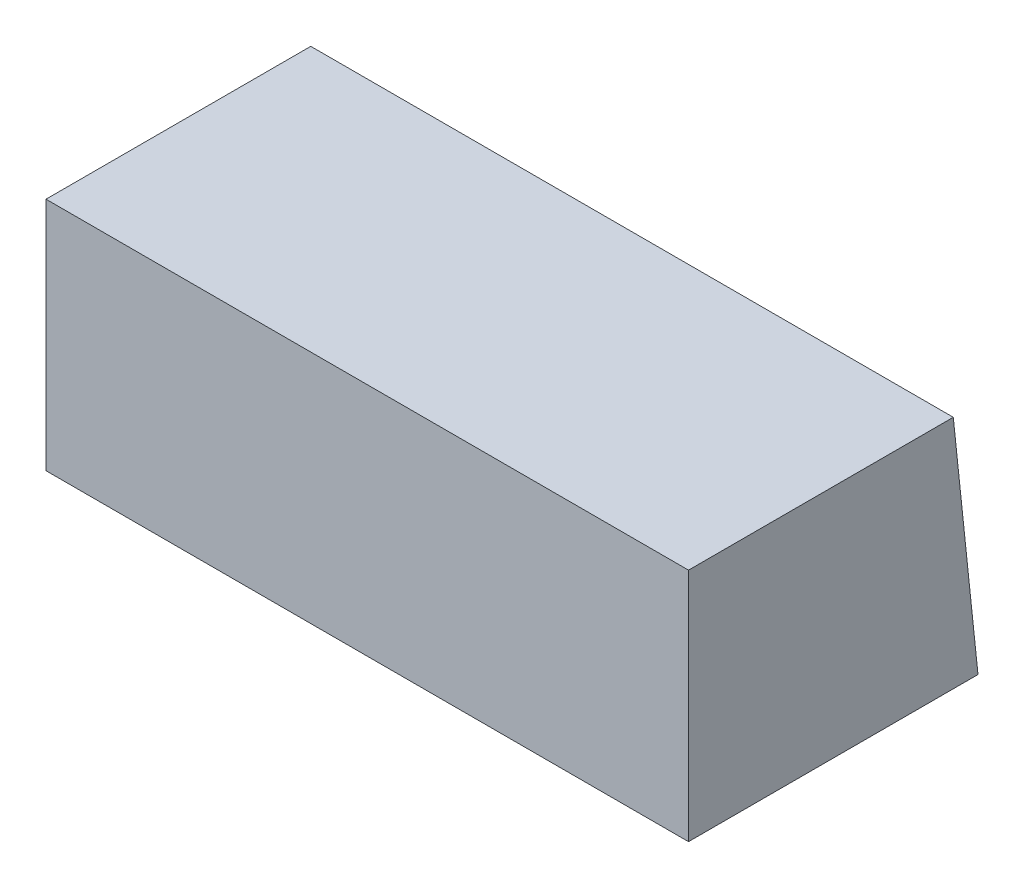
ISO-10303-21;
HEADER;
FILE_DESCRIPTION(('STEP AP214'),'2;1');
FILE_NAME('part.step','',(''),(''),'','','');
FILE_SCHEMA(('AUTOMOTIVE_DESIGN { 1 0 10303 214 1 1 1 1 }'));
ENDSEC;
DATA;
#1=APPLICATION_CONTEXT('core data for automotive mechanical design processes');
#2=APPLICATION_PROTOCOL_DEFINITION('international standard','automotive_design',2000,#1);
#3=PRODUCT_CONTEXT('',#1,'mechanical');
#4=PRODUCT('Part','Part','',(#3));
#5=PRODUCT_RELATED_PRODUCT_CATEGORY('part','',(#4));
#6=PRODUCT_DEFINITION_FORMATION('','',#4);
#7=PRODUCT_DEFINITION_CONTEXT('part definition',#1,'design');
#8=PRODUCT_DEFINITION('design','',#6,#7);
#9=PRODUCT_DEFINITION_SHAPE('','',#8);
#10=(LENGTH_UNIT() NAMED_UNIT(*) SI_UNIT(.MILLI.,.METRE.));
#11=(NAMED_UNIT(*) PLANE_ANGLE_UNIT() SI_UNIT($,.RADIAN.));
#12=(NAMED_UNIT(*) SI_UNIT($,.STERADIAN.) SOLID_ANGLE_UNIT());
#13=UNCERTAINTY_MEASURE_WITH_UNIT(LENGTH_MEASURE(1.E-05),#10,'distance_accuracy_value','');
#14=(GEOMETRIC_REPRESENTATION_CONTEXT(3) GLOBAL_UNCERTAINTY_ASSIGNED_CONTEXT((#13)) GLOBAL_UNIT_ASSIGNED_CONTEXT((#10,
#11,#12)) REPRESENTATION_CONTEXT('',''));
#15=CARTESIAN_POINT('',(0.,0.,0.));
#16=DIRECTION('',(0.,0.,1.));
#17=DIRECTION('',(1.,0.,0.));
#18=AXIS2_PLACEMENT_3D('',#15,#16,#17);
#19=CARTESIAN_POINT('',(53.4582450160276,13.2407708873239,39.4916610984402));
#20=DIRECTION('',(-1.,0.,0.));
#21=DIRECTION('',(0.,0.,1.));
#22=AXIS2_PLACEMENT_3D('',#19,#20,#21);
#23=PLANE('',#22);
#24=DIRECTION('',(0.,-0.994521895368273,-0.104528463267654));
#25=VECTOR('',#24,1.);
#26=CARTESIAN_POINT('',(53.4582450160276,0.,38.1));
#27=LINE('',#26,#25);
#28=CARTESIAN_POINT('',(53.4582450160277,13.2407708873239,39.4916610984402));
#29=VERTEX_POINT('',#28);
#30=CARTESIAN_POINT('',(53.4582450160277,54.8885929453376,43.8690235863287));
#31=VERTEX_POINT('',#30);
#32=EDGE_CURVE('E39',#29,#31,#27,.F.);
#33=ORIENTED_EDGE('',*,*,#32,.T.);
#34=DIRECTION('',(0.,0.,-1.));
#35=VECTOR('',#34,1.);
#36=CARTESIAN_POINT('',(53.4582450160276,54.8885929453376,43.8690235863287));
#37=LINE('',#36,#35);
#38=CARTESIAN_POINT('',(53.4582450160277,54.8885929453376,90.7593904150351));
#39=VERTEX_POINT('',#38);
#40=EDGE_CURVE('E77',#39,#31,#37,.T.);
#41=ORIENTED_EDGE('',*,*,#40,.F.);
#42=DIRECTION('',(0.,-1.,0.));
#43=VECTOR('',#42,1.);
#44=CARTESIAN_POINT('',(53.4582450160276,100.18,90.7593904150351));
#45=LINE('',#44,#43);
#46=CARTESIAN_POINT('',(53.4582450160277,13.2407708873239,90.7593904150351));
#47=VERTEX_POINT('',#46);
#48=EDGE_CURVE('E52',#39,#47,#45,.T.);
#49=ORIENTED_EDGE('',*,*,#48,.T.);
#50=DIRECTION('',(0.,0.,-1.));
#51=VECTOR('',#50,1.);
#52=CARTESIAN_POINT('',(53.4582450160276,13.2407708873239,39.4916610984402));
#53=LINE('',#52,#51);
#54=EDGE_CURVE('E44',#47,#29,#53,.T.);
#55=ORIENTED_EDGE('',*,*,#54,.T.);
#56=EDGE_LOOP('',(#33,#41,#49,#55));
#57=FACE_BOUND('',#56,.T.);
#58=ADVANCED_FACE('F36',(#57),#23,.F.);
#59=CARTESIAN_POINT('',(53.4582450160276,54.8885929453376,43.8690235863287));
#60=DIRECTION('',(0.,-1.,0.));
#61=DIRECTION('',(0.,0.,-1.));
#62=AXIS2_PLACEMENT_3D('',#59,#60,#61);
#63=PLANE('',#62);
#64=DIRECTION('',(1.,0.,0.));
#65=VECTOR('',#64,1.);
#66=CARTESIAN_POINT('',(-68.5799999999999,54.8885929453376,43.8690235863287));
#67=LINE('',#66,#65);
#68=CARTESIAN_POINT('',(-60.3332142431596,54.8885929453376,43.8690235863287));
#69=VERTEX_POINT('',#68);
#70=EDGE_CURVE('E84',#31,#69,#67,.F.);
#71=ORIENTED_EDGE('',*,*,#70,.T.);
#72=DIRECTION('',(0.,0.,-1.));
#73=VECTOR('',#72,1.);
#74=CARTESIAN_POINT('',(-60.3332142431596,54.8885929453376,43.8690235863287));
#75=LINE('',#74,#73);
#76=CARTESIAN_POINT('',(-60.3332142431596,54.8885929453376,90.7593904150351));
#77=VERTEX_POINT('',#76);
#78=EDGE_CURVE('E91',#77,#69,#75,.T.);
#79=ORIENTED_EDGE('',*,*,#78,.F.);
#80=DIRECTION('',(1.,0.,0.));
#81=VECTOR('',#80,1.);
#82=CARTESIAN_POINT('',(-142.792126276609,54.8885929453376,90.7593904150351));
#83=LINE('',#82,#81);
#84=EDGE_CURVE('E90',#77,#39,#83,.T.);
#85=ORIENTED_EDGE('',*,*,#84,.T.);
#86=ORIENTED_EDGE('',*,*,#40,.T.);
#87=EDGE_LOOP('',(#71,#79,#85,#86));
#88=FACE_BOUND('',#87,.T.);
#89=ADVANCED_FACE('F87',(#88),#63,.F.);
#90=CARTESIAN_POINT('',(-60.3332142431596,54.8885929453376,43.8690235863287));
#91=DIRECTION('',(1.,0.,0.));
#92=DIRECTION('',(0.,0.,-1.));
#93=AXIS2_PLACEMENT_3D('',#90,#91,#92);
#94=PLANE('',#93);
#95=DIRECTION('',(0.,0.994521895368273,0.104528463267654));
#96=VECTOR('',#95,1.);
#97=CARTESIAN_POINT('',(-60.3332142431596,0.,38.1));
#98=LINE('',#97,#96);
#99=CARTESIAN_POINT('',(-60.3332142431596,13.2407708873239,39.4916610984402));
#100=VERTEX_POINT('',#99);
#101=EDGE_CURVE('E97',#69,#100,#98,.F.);
#102=ORIENTED_EDGE('',*,*,#101,.T.);
#103=DIRECTION('',(0.,0.,-1.));
#104=VECTOR('',#103,1.);
#105=CARTESIAN_POINT('',(-60.3332142431596,13.2407708873239,39.4916610984402));
#106=LINE('',#105,#104);
#107=CARTESIAN_POINT('',(-60.3332142431596,13.2407708873239,90.7593904150351));
#108=VERTEX_POINT('',#107);
#109=EDGE_CURVE('E11',#108,#100,#106,.T.);
#110=ORIENTED_EDGE('',*,*,#109,.F.);
#111=DIRECTION('',(0.,1.,0.));
#112=VECTOR('',#111,1.);
#113=CARTESIAN_POINT('',(-60.3332142431596,100.18,90.7593904150351));
#114=LINE('',#113,#112);
#115=EDGE_CURVE('E59',#108,#77,#114,.T.);
#116=ORIENTED_EDGE('',*,*,#115,.T.);
#117=ORIENTED_EDGE('',*,*,#78,.T.);
#118=EDGE_LOOP('',(#102,#110,#116,#117));
#119=FACE_BOUND('',#118,.T.);
#120=ADVANCED_FACE('F113',(#119),#94,.F.);
#121=CARTESIAN_POINT('',(-60.3332142431596,13.2407708873239,39.4916610984402));
#122=DIRECTION('',(0.,1.,0.));
#123=DIRECTION('',(0.,0.,1.));
#124=AXIS2_PLACEMENT_3D('',#121,#122,#123);
#125=PLANE('',#124);
#126=DIRECTION('',(-1.,0.,0.));
#127=VECTOR('',#126,1.);
#128=CARTESIAN_POINT('',(-68.5799999999999,13.2407708873239,39.4916610984402));
#129=LINE('',#128,#127);
#130=EDGE_CURVE('E99',#100,#29,#129,.F.);
#131=ORIENTED_EDGE('',*,*,#130,.T.);
#132=ORIENTED_EDGE('',*,*,#54,.F.);
#133=DIRECTION('',(-1.,0.,0.));
#134=VECTOR('',#133,1.);
#135=CARTESIAN_POINT('',(-142.792126276609,13.2407708873239,90.7593904150351));
#136=LINE('',#135,#134);
#137=EDGE_CURVE('E92',#47,#108,#136,.T.);
#138=ORIENTED_EDGE('',*,*,#137,.T.);
#139=ORIENTED_EDGE('',*,*,#109,.T.);
#140=EDGE_LOOP('',(#131,#132,#138,#139));
#141=FACE_BOUND('',#140,.T.);
#142=ADVANCED_FACE('F114',(#141),#125,.F.);
#143=CARTESIAN_POINT('',(-142.792126276609,100.18,90.7593904150351));
#144=DIRECTION('',(0.,0.,1.));
#145=DIRECTION('',(1.,0.,0.));
#146=AXIS2_PLACEMENT_3D('',#143,#144,#145);
#147=PLANE('',#146);
#148=ORIENTED_EDGE('',*,*,#48,.F.);
#149=ORIENTED_EDGE('',*,*,#84,.F.);
#150=ORIENTED_EDGE('',*,*,#115,.F.);
#151=ORIENTED_EDGE('',*,*,#137,.F.);
#152=EDGE_LOOP('',(#148,#149,#150,#151));
#153=FACE_BOUND('',#152,.T.);
#154=ADVANCED_FACE('F116',(#153),#147,.T.);
#155=CARTESIAN_POINT('',(0.,-3.42971311667862,32.6315405655082));
#156=DIRECTION('',(0.,0.104528463267653,-0.994521895368274));
#157=DIRECTION('',(0.,0.994521895368274,0.104528463267653));
#158=AXIS2_PLACEMENT_3D('',#155,#156,#157);
#159=PLANE('',#158);
#160=CARTESIAN_POINT('',(26.67,40.0183324463715,37.1981141682008));
#161=DIRECTION('',(0.,0.104528463267653,-0.994521895368274));
#162=DIRECTION('',(0.,0.994521895368274,0.104528463267653));
#163=AXIS2_PLACEMENT_3D('',#160,#161,#162);
#164=CIRCLE('',#163,5.45251538643406);
#165=CARTESIAN_POINT('',(26.67,45.4409783830126,37.768057222488));
#166=VERTEX_POINT('',#165);
#167=EDGE_CURVE('E85',#166,#166,#164,.T.);
#168=ORIENTED_EDGE('',*,*,#167,.T.);
#169=EDGE_LOOP('',(#168));
#170=FACE_BOUND('',#169,.T.);
#171=ADVANCED_FACE('F122',(#170),#159,.T.);
#172=CARTESIAN_POINT('',(0.,-3.42971311667859,32.6315405655082));
#173=DIRECTION('',(0.,0.104528463267652,-0.994521895368274));
#174=DIRECTION('',(0.,0.994521895368274,0.104528463267652));
#175=AXIS2_PLACEMENT_3D('',#172,#173,#174);
#176=PLANE('',#175);
#177=CARTESIAN_POINT('',(-26.67,27.3879043751944,35.8706026847016));
#178=DIRECTION('',(0.,-0.104528463267654,0.994521895368273));
#179=DIRECTION('',(0.,-0.994521895368273,-0.104528463267654));
#180=AXIS2_PLACEMENT_3D('',#177,#178,#179);
#181=CIRCLE('',#180,5.45251538643406);
#182=CARTESIAN_POINT('',(-26.67,21.9652584385534,35.3006596304145));
#183=VERTEX_POINT('',#182);
#184=EDGE_CURVE('E375',#183,#183,#181,.F.);
#185=ORIENTED_EDGE('',*,*,#184,.T.);
#186=EDGE_LOOP('',(#185));
#187=FACE_BOUND('',#186,.T.);
#188=ADVANCED_FACE('F160',(#187),#176,.T.);
#189=CARTESIAN_POINT('',(0.,-3.42971311667857,32.6315405655083));
#190=DIRECTION('',(0.,0.104528463267651,-0.994521895368274));
#191=DIRECTION('',(0.,0.994521895368274,0.104528463267651));
#192=AXIS2_PLACEMENT_3D('',#189,#190,#191);
#193=PLANE('',#192);
#194=CARTESIAN_POINT('',(-8.89000000000003,27.3879043751944,35.8706026847016));
#195=DIRECTION('',(0.,-0.104528463267654,0.994521895368273));
#196=DIRECTION('',(0.,-0.994521895368273,-0.104528463267654));
#197=AXIS2_PLACEMENT_3D('',#194,#195,#196);
#198=CIRCLE('',#197,5.45251538643406);
#199=CARTESIAN_POINT('',(-8.89000000000003,21.9652584385534,35.3006596304145));
#200=VERTEX_POINT('',#199);
#201=EDGE_CURVE('E381',#200,#200,#198,.F.);
#202=ORIENTED_EDGE('',*,*,#201,.T.);
#203=EDGE_LOOP('',(#202));
#204=FACE_BOUND('',#203,.T.);
#205=ADVANCED_FACE('F172',(#204),#193,.T.);
#206=CARTESIAN_POINT('',(0.,-3.42971311667857,32.6315405655083));
#207=DIRECTION('',(0.,0.104528463267651,-0.994521895368274));
#208=DIRECTION('',(0.,0.994521895368274,0.104528463267651));
#209=AXIS2_PLACEMENT_3D('',#206,#207,#208);
#210=PLANE('',#209);
#211=CARTESIAN_POINT('',(8.88999999999997,27.3879043751944,35.8706026847016));
#212=DIRECTION('',(0.,-0.104528463267654,0.994521895368273));
#213=DIRECTION('',(0.,-0.994521895368273,-0.104528463267654));
#214=AXIS2_PLACEMENT_3D('',#211,#212,#213);
#215=CIRCLE('',#214,5.45251538643406);
#216=CARTESIAN_POINT('',(8.88999999999997,21.9652584385534,35.3006596304145));
#217=VERTEX_POINT('',#216);
#218=EDGE_CURVE('E391',#217,#217,#215,.F.);
#219=ORIENTED_EDGE('',*,*,#218,.T.);
#220=EDGE_LOOP('',(#219));
#221=FACE_BOUND('',#220,.T.);
#222=ADVANCED_FACE('F183',(#221),#210,.T.);
#223=CARTESIAN_POINT('',(0.,-3.42971311667862,32.6315405655082));
#224=DIRECTION('',(0.,0.104528463267653,-0.994521895368274));
#225=DIRECTION('',(0.,0.994521895368274,0.104528463267653));
#226=AXIS2_PLACEMENT_3D('',#223,#224,#225);
#227=PLANE('',#226);
#228=CARTESIAN_POINT('',(8.88999999999997,40.0183324463715,37.1981141682008));
#229=DIRECTION('',(0.,-0.104528463267654,0.994521895368273));
#230=DIRECTION('',(0.,-0.994521895368273,-0.104528463267654));
#231=AXIS2_PLACEMENT_3D('',#228,#229,#230);
#232=CIRCLE('',#231,5.45251538643406);
#233=CARTESIAN_POINT('',(8.88999999999997,34.5956865097304,36.6281711139136));
#234=VERTEX_POINT('',#233);
#235=EDGE_CURVE('E400',#234,#234,#232,.F.);
#236=ORIENTED_EDGE('',*,*,#235,.T.);
#237=EDGE_LOOP('',(#236));
#238=FACE_BOUND('',#237,.T.);
#239=ADVANCED_FACE('F194',(#238),#227,.T.);
#240=CARTESIAN_POINT('',(0.,-3.42971311667857,32.6315405655083));
#241=DIRECTION('',(0.,0.104528463267651,-0.994521895368274));
#242=DIRECTION('',(0.,0.994521895368274,0.104528463267651));
#243=AXIS2_PLACEMENT_3D('',#240,#241,#242);
#244=PLANE('',#243);
#245=CARTESIAN_POINT('',(-8.89000000000003,40.0183324463715,37.1981141682008));
#246=DIRECTION('',(0.,-0.104528463267654,0.994521895368273));
#247=DIRECTION('',(0.,-0.994521895368273,-0.104528463267654));
#248=AXIS2_PLACEMENT_3D('',#245,#246,#247);
#249=CIRCLE('',#248,5.45251538643405);
#250=CARTESIAN_POINT('',(-8.89000000000003,34.5956865097304,36.6281711139136));
#251=VERTEX_POINT('',#250);
#252=EDGE_CURVE('E409',#251,#251,#249,.F.);
#253=ORIENTED_EDGE('',*,*,#252,.T.);
#254=EDGE_LOOP('',(#253));
#255=FACE_BOUND('',#254,.T.);
#256=ADVANCED_FACE('F205',(#255),#244,.T.);
#257=CARTESIAN_POINT('',(0.,-3.42971311667858,32.6315405655083));
#258=DIRECTION('',(0.,0.104528463267651,-0.994521895368274));
#259=DIRECTION('',(0.,0.994521895368274,0.104528463267651));
#260=AXIS2_PLACEMENT_3D('',#257,#258,#259);
#261=PLANE('',#260);
#262=CARTESIAN_POINT('',(-26.67,40.0183324463715,37.1981141682008));
#263=DIRECTION('',(0.,-0.104528463267654,0.994521895368273));
#264=DIRECTION('',(0.,-0.994521895368273,-0.104528463267654));
#265=AXIS2_PLACEMENT_3D('',#262,#263,#264);
#266=CIRCLE('',#265,5.45251538643405);
#267=CARTESIAN_POINT('',(-26.67,34.5956865097304,36.6281711139136));
#268=VERTEX_POINT('',#267);
#269=EDGE_CURVE('E418',#268,#268,#266,.F.);
#270=ORIENTED_EDGE('',*,*,#269,.T.);
#271=EDGE_LOOP('',(#270));
#272=FACE_BOUND('',#271,.T.);
#273=ADVANCED_FACE('F216',(#272),#261,.T.);
#274=CARTESIAN_POINT('',(0.,-3.4297131166786,32.6315405655082));
#275=DIRECTION('',(0.,0.104528463267652,-0.994521895368274));
#276=DIRECTION('',(0.,0.994521895368274,0.104528463267652));
#277=AXIS2_PLACEMENT_3D('',#274,#275,#276);
#278=PLANE('',#277);
#279=CARTESIAN_POINT('',(26.67,27.3879043751944,35.8706026847016));
#280=DIRECTION('',(0.,-0.104528463267654,0.994521895368273));
#281=DIRECTION('',(0.,-0.994521895368273,-0.104528463267654));
#282=AXIS2_PLACEMENT_3D('',#279,#280,#281);
#283=CIRCLE('',#282,5.45251538643406);
#284=CARTESIAN_POINT('',(26.67,21.9652584385534,35.3006596304145));
#285=VERTEX_POINT('',#284);
#286=EDGE_CURVE('E427',#285,#285,#283,.F.);
#287=ORIENTED_EDGE('',*,*,#286,.T.);
#288=EDGE_LOOP('',(#287));
#289=FACE_BOUND('',#288,.T.);
#290=ADVANCED_FACE('F227',(#289),#278,.T.);
#291=CARTESIAN_POINT('',(26.67,49.6788201502759,-54.7152866522814));
#292=DIRECTION('',(0.,-0.104528463267654,0.994521895368273));
#293=DIRECTION('',(0.,-0.994521895368273,-0.104528463267654));
#294=AXIS2_PLACEMENT_3D('',#291,#292,#293);
#295=CYLINDRICAL_SURFACE('',#294,5.45251538643406);
#296=ORIENTED_EDGE('',*,*,#167,.F.);
#297=EDGE_LOOP('',(#296));
#298=FACE_BOUND('',#297,.T.);
#299=CARTESIAN_POINT('',(26.67,39.4873278529718,42.2502853966717));
#300=DIRECTION('',(0.,0.104528463267654,-0.994521895368273));
#301=DIRECTION('',(0.,0.994521895368273,0.104528463267654));
#302=AXIS2_PLACEMENT_3D('',#299,#300,#301);
#303=CIRCLE('',#302,5.45251538643406);
#304=CARTESIAN_POINT('',(26.67,44.9099737896129,42.8202284509589));
#305=VERTEX_POINT('',#304);
#306=EDGE_CURVE('E441',#305,#305,#303,.T.);
#307=ORIENTED_EDGE('',*,*,#306,.T.);
#308=EDGE_LOOP('',(#307));
#309=FACE_BOUND('',#308,.T.);
#310=ADVANCED_FACE('F238',(#298,#309),#295,.T.);
#311=CARTESIAN_POINT('',(-26.67,37.0483920790988,-56.0427981357806));
#312=DIRECTION('',(0.,-0.104528463267654,0.994521895368273));
#313=DIRECTION('',(0.,-0.994521895368273,-0.104528463267654));
#314=AXIS2_PLACEMENT_3D('',#311,#312,#313);
#315=CYLINDRICAL_SURFACE('',#314,5.45251538643406);
#316=ORIENTED_EDGE('',*,*,#184,.F.);
#317=EDGE_LOOP('',(#316));
#318=FACE_BOUND('',#317,.T.);
#319=CARTESIAN_POINT('',(-26.67,26.8568997817947,40.9227739131725));
#320=DIRECTION('',(0.,0.104528463267654,-0.994521895368273));
#321=DIRECTION('',(0.,0.994521895368273,0.104528463267654));
#322=AXIS2_PLACEMENT_3D('',#319,#320,#321);
#323=CIRCLE('',#322,5.45251538643406);
#324=CARTESIAN_POINT('',(-26.67,32.2795457184358,41.4927169674596));
#325=VERTEX_POINT('',#324);
#326=EDGE_CURVE('E449',#325,#325,#323,.T.);
#327=ORIENTED_EDGE('',*,*,#326,.T.);
#328=EDGE_LOOP('',(#327));
#329=FACE_BOUND('',#328,.T.);
#330=ADVANCED_FACE('F250',(#318,#329),#315,.T.);
#331=CARTESIAN_POINT('',(-8.89000000000003,37.0483920790988,-56.0427981357806));
#332=DIRECTION('',(0.,-0.104528463267654,0.994521895368273));
#333=DIRECTION('',(0.,-0.994521895368273,-0.104528463267654));
#334=AXIS2_PLACEMENT_3D('',#331,#332,#333);
#335=CYLINDRICAL_SURFACE('',#334,5.45251538643406);
#336=ORIENTED_EDGE('',*,*,#201,.F.);
#337=EDGE_LOOP('',(#336));
#338=FACE_BOUND('',#337,.T.);
#339=CARTESIAN_POINT('',(-8.89000000000003,26.8568997817947,40.9227739131725));
#340=DIRECTION('',(0.,0.104528463267654,-0.994521895368273));
#341=DIRECTION('',(0.,0.994521895368273,0.104528463267654));
#342=AXIS2_PLACEMENT_3D('',#339,#340,#341);
#343=CIRCLE('',#342,5.45251538643406);
#344=CARTESIAN_POINT('',(-8.89000000000003,32.2795457184358,41.4927169674596));
#345=VERTEX_POINT('',#344);
#346=EDGE_CURVE('E453',#345,#345,#343,.T.);
#347=ORIENTED_EDGE('',*,*,#346,.T.);
#348=EDGE_LOOP('',(#347));
#349=FACE_BOUND('',#348,.T.);
#350=ADVANCED_FACE('F261',(#338,#349),#335,.T.);
#351=CARTESIAN_POINT('',(8.88999999999997,37.0483920790988,-56.0427981357806));
#352=DIRECTION('',(0.,-0.104528463267654,0.994521895368273));
#353=DIRECTION('',(0.,-0.994521895368273,-0.104528463267654));
#354=AXIS2_PLACEMENT_3D('',#351,#352,#353);
#355=CYLINDRICAL_SURFACE('',#354,5.45251538643406);
#356=ORIENTED_EDGE('',*,*,#218,.F.);
#357=EDGE_LOOP('',(#356));
#358=FACE_BOUND('',#357,.T.);
#359=CARTESIAN_POINT('',(8.88999999999997,26.8568997817947,40.9227739131725));
#360=DIRECTION('',(0.,0.104528463267654,-0.994521895368273));
#361=DIRECTION('',(0.,0.994521895368273,0.104528463267654));
#362=AXIS2_PLACEMENT_3D('',#359,#360,#361);
#363=CIRCLE('',#362,5.45251538643406);
#364=CARTESIAN_POINT('',(8.88999999999997,32.2795457184358,41.4927169674596));
#365=VERTEX_POINT('',#364);
#366=EDGE_CURVE('E456',#365,#365,#363,.T.);
#367=ORIENTED_EDGE('',*,*,#366,.T.);
#368=EDGE_LOOP('',(#367));
#369=FACE_BOUND('',#368,.T.);
#370=ADVANCED_FACE('F272',(#358,#369),#355,.T.);
#371=CARTESIAN_POINT('',(8.88999999999997,49.6788201502759,-54.7152866522814));
#372=DIRECTION('',(0.,-0.104528463267654,0.994521895368273));
#373=DIRECTION('',(0.,-0.994521895368273,-0.104528463267654));
#374=AXIS2_PLACEMENT_3D('',#371,#372,#373);
#375=CYLINDRICAL_SURFACE('',#374,5.45251538643406);
#376=ORIENTED_EDGE('',*,*,#235,.F.);
#377=EDGE_LOOP('',(#376));
#378=FACE_BOUND('',#377,.T.);
#379=CARTESIAN_POINT('',(8.88999999999997,39.4873278529718,42.2502853966717));
#380=DIRECTION('',(0.,0.104528463267654,-0.994521895368273));
#381=DIRECTION('',(0.,0.994521895368273,0.104528463267654));
#382=AXIS2_PLACEMENT_3D('',#379,#380,#381);
#383=CIRCLE('',#382,5.45251538643406);
#384=CARTESIAN_POINT('',(8.88999999999997,44.9099737896129,42.8202284509589));
#385=VERTEX_POINT('',#384);
#386=EDGE_CURVE('E459',#385,#385,#383,.T.);
#387=ORIENTED_EDGE('',*,*,#386,.T.);
#388=EDGE_LOOP('',(#387));
#389=FACE_BOUND('',#388,.T.);
#390=ADVANCED_FACE('F283',(#378,#389),#375,.T.);
#391=CARTESIAN_POINT('',(-8.89000000000003,49.6788201502759,-54.7152866522814));
#392=DIRECTION('',(0.,-0.104528463267654,0.994521895368273));
#393=DIRECTION('',(0.,-0.994521895368273,-0.104528463267654));
#394=AXIS2_PLACEMENT_3D('',#391,#392,#393);
#395=CYLINDRICAL_SURFACE('',#394,5.45251538643405);
#396=ORIENTED_EDGE('',*,*,#252,.F.);
#397=EDGE_LOOP('',(#396));
#398=FACE_BOUND('',#397,.T.);
#399=CARTESIAN_POINT('',(-8.89000000000003,39.4873278529718,42.2502853966717));
#400=DIRECTION('',(0.,0.104528463267654,-0.994521895368273));
#401=DIRECTION('',(0.,0.994521895368273,0.104528463267654));
#402=AXIS2_PLACEMENT_3D('',#399,#400,#401);
#403=CIRCLE('',#402,5.45251538643405);
#404=CARTESIAN_POINT('',(-8.89000000000003,44.9099737896129,42.8202284509589));
#405=VERTEX_POINT('',#404);
#406=EDGE_CURVE('E462',#405,#405,#403,.T.);
#407=ORIENTED_EDGE('',*,*,#406,.T.);
#408=EDGE_LOOP('',(#407));
#409=FACE_BOUND('',#408,.T.);
#410=ADVANCED_FACE('F294',(#398,#409),#395,.T.);
#411=CARTESIAN_POINT('',(-26.67,49.6788201502759,-54.7152866522814));
#412=DIRECTION('',(0.,-0.104528463267654,0.994521895368273));
#413=DIRECTION('',(0.,-0.994521895368273,-0.104528463267654));
#414=AXIS2_PLACEMENT_3D('',#411,#412,#413);
#415=CYLINDRICAL_SURFACE('',#414,5.45251538643405);
#416=ORIENTED_EDGE('',*,*,#269,.F.);
#417=EDGE_LOOP('',(#416));
#418=FACE_BOUND('',#417,.T.);
#419=CARTESIAN_POINT('',(-26.67,39.4873278529718,42.2502853966717));
#420=DIRECTION('',(0.,0.104528463267654,-0.994521895368273));
#421=DIRECTION('',(0.,0.994521895368273,0.104528463267654));
#422=AXIS2_PLACEMENT_3D('',#419,#420,#421);
#423=CIRCLE('',#422,5.45251538643405);
#424=CARTESIAN_POINT('',(-26.67,44.9099737896129,42.8202284509589));
#425=VERTEX_POINT('',#424);
#426=EDGE_CURVE('E465',#425,#425,#423,.T.);
#427=ORIENTED_EDGE('',*,*,#426,.T.);
#428=EDGE_LOOP('',(#427));
#429=FACE_BOUND('',#428,.T.);
#430=ADVANCED_FACE('F305',(#418,#429),#415,.T.);
#431=CARTESIAN_POINT('',(26.67,37.0483920790988,-56.0427981357806));
#432=DIRECTION('',(0.,-0.104528463267654,0.994521895368273));
#433=DIRECTION('',(0.,-0.994521895368273,-0.104528463267654));
#434=AXIS2_PLACEMENT_3D('',#431,#432,#433);
#435=CYLINDRICAL_SURFACE('',#434,5.45251538643406);
#436=ORIENTED_EDGE('',*,*,#286,.F.);
#437=EDGE_LOOP('',(#436));
#438=FACE_BOUND('',#437,.T.);
#439=CARTESIAN_POINT('',(26.67,26.8568997817947,40.9227739131725));
#440=DIRECTION('',(0.,0.104528463267654,-0.994521895368273));
#441=DIRECTION('',(0.,0.994521895368273,0.104528463267654));
#442=AXIS2_PLACEMENT_3D('',#439,#440,#441);
#443=CIRCLE('',#442,5.45251538643406);
#444=CARTESIAN_POINT('',(26.67,32.2795457184358,41.4927169674596));
#445=VERTEX_POINT('',#444);
#446=EDGE_CURVE('E110',#445,#445,#443,.T.);
#447=ORIENTED_EDGE('',*,*,#446,.T.);
#448=EDGE_LOOP('',(#447));
#449=FACE_BOUND('',#448,.T.);
#450=ADVANCED_FACE('F126',(#438,#449),#435,.T.);
#451=CARTESIAN_POINT('',(-68.5799999999999,0.,38.1));
#452=DIRECTION('',(0.,-0.104528463267654,0.994521895368273));
#453=DIRECTION('',(0.,-0.994521895368273,-0.104528463267654));
#454=AXIS2_PLACEMENT_3D('',#451,#452,#453);
#455=PLANE('',#454);
#456=ORIENTED_EDGE('',*,*,#32,.F.);
#457=ORIENTED_EDGE('',*,*,#130,.F.);
#458=ORIENTED_EDGE('',*,*,#101,.F.);
#459=ORIENTED_EDGE('',*,*,#70,.F.);
#460=EDGE_LOOP('',(#456,#457,#458,#459));
#461=FACE_BOUND('',#460,.T.);
#462=ORIENTED_EDGE('',*,*,#446,.F.);
#463=EDGE_LOOP('',(#462));
#464=FACE_BOUND('',#463,.T.);
#465=ORIENTED_EDGE('',*,*,#426,.F.);
#466=EDGE_LOOP('',(#465));
#467=FACE_BOUND('',#466,.T.);
#468=ORIENTED_EDGE('',*,*,#406,.F.);
#469=EDGE_LOOP('',(#468));
#470=FACE_BOUND('',#469,.T.);
#471=ORIENTED_EDGE('',*,*,#386,.F.);
#472=EDGE_LOOP('',(#471));
#473=FACE_BOUND('',#472,.T.);
#474=ORIENTED_EDGE('',*,*,#366,.F.);
#475=EDGE_LOOP('',(#474));
#476=FACE_BOUND('',#475,.T.);
#477=ORIENTED_EDGE('',*,*,#346,.F.);
#478=EDGE_LOOP('',(#477));
#479=FACE_BOUND('',#478,.T.);
#480=ORIENTED_EDGE('',*,*,#326,.F.);
#481=EDGE_LOOP('',(#480));
#482=FACE_BOUND('',#481,.T.);
#483=ORIENTED_EDGE('',*,*,#306,.F.);
#484=EDGE_LOOP('',(#483));
#485=FACE_BOUND('',#484,.T.);
#486=ADVANCED_FACE('F95',(#461,#464,#467,#470,#473,#476,#479,#482,#485),#455,.F.);
#487=CLOSED_SHELL('',(#58,#89,#120,#142,#154,#171,#188,#205,#222,#239,#256,#273,#290,#310,#330,
#350,#370,#390,#410,#430,#450,#486));
#488=MANIFOLD_SOLID_BREP('B2',#487);
#489=ADVANCED_BREP_SHAPE_REPRESENTATION('',(#18,#488),#14);
#490=SHAPE_DEFINITION_REPRESENTATION(#9,#489);
ENDSEC;
END-ISO-10303-21;
